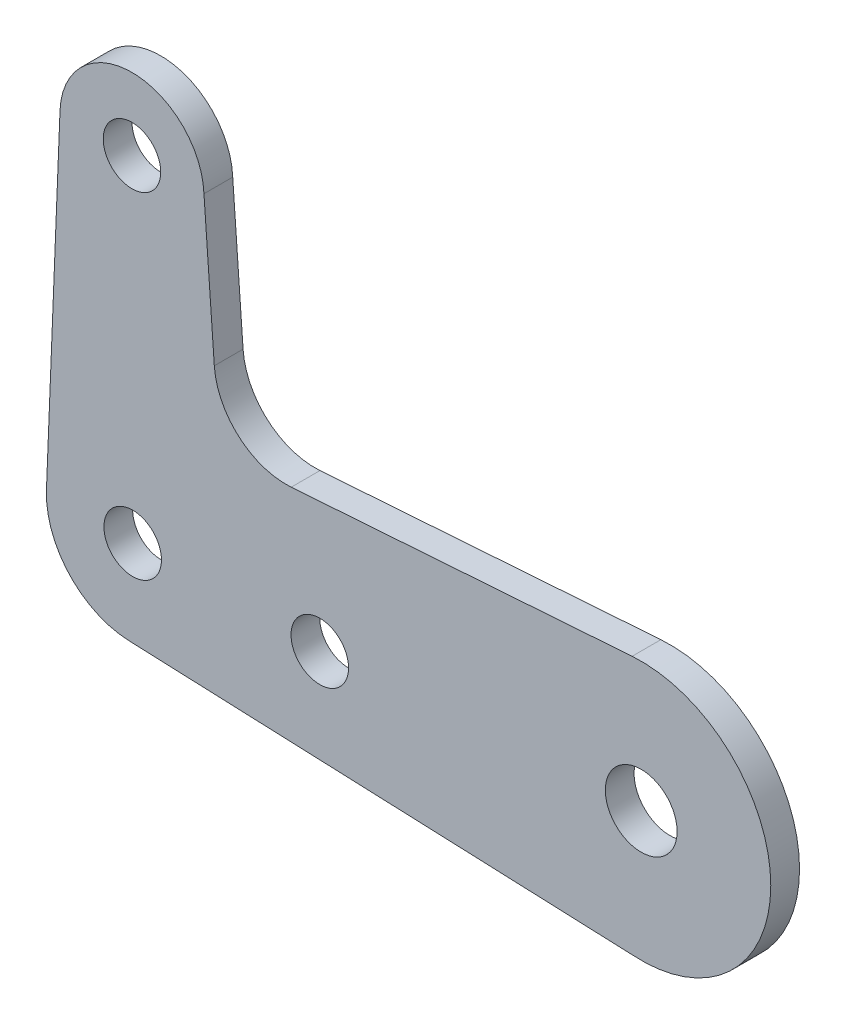
ISO-10303-21;
HEADER;
FILE_DESCRIPTION(('STEP AP214'),'2;1');
FILE_NAME('part.step','',(''),(''),'','','');
FILE_SCHEMA(('AUTOMOTIVE_DESIGN { 1 0 10303 214 1 1 1 1 }'));
ENDSEC;
DATA;
#1=APPLICATION_CONTEXT('core data for automotive mechanical design processes');
#2=APPLICATION_PROTOCOL_DEFINITION('international standard','automotive_design',2000,#1);
#3=PRODUCT_CONTEXT('',#1,'mechanical');
#4=PRODUCT('Part','Part','',(#3));
#5=PRODUCT_RELATED_PRODUCT_CATEGORY('part','',(#4));
#6=PRODUCT_DEFINITION_FORMATION('','',#4);
#7=PRODUCT_DEFINITION_CONTEXT('part definition',#1,'design');
#8=PRODUCT_DEFINITION('design','',#6,#7);
#9=PRODUCT_DEFINITION_SHAPE('','',#8);
#10=(LENGTH_UNIT() NAMED_UNIT(*) SI_UNIT(.MILLI.,.METRE.));
#11=(NAMED_UNIT(*) PLANE_ANGLE_UNIT() SI_UNIT($,.RADIAN.));
#12=(NAMED_UNIT(*) SI_UNIT($,.STERADIAN.) SOLID_ANGLE_UNIT());
#13=UNCERTAINTY_MEASURE_WITH_UNIT(LENGTH_MEASURE(1.E-05),#10,'distance_accuracy_value','');
#14=(GEOMETRIC_REPRESENTATION_CONTEXT(3) GLOBAL_UNCERTAINTY_ASSIGNED_CONTEXT((#13)) GLOBAL_UNIT_ASSIGNED_CONTEXT((#10,
#11,#12)) REPRESENTATION_CONTEXT('',''));
#15=CARTESIAN_POINT('',(0.,0.,0.));
#16=DIRECTION('',(0.,0.,1.));
#17=DIRECTION('',(1.,0.,0.));
#18=AXIS2_PLACEMENT_3D('',#15,#16,#17);
#19=CARTESIAN_POINT('',(-0.654126674944978,30.9800410439159,3.175));
#20=DIRECTION('',(0.,0.,-1.));
#21=DIRECTION('',(-1.,0.,0.));
#22=AXIS2_PLACEMENT_3D('',#19,#20,#21);
#23=CYLINDRICAL_SURFACE('',#22,7.9502);
#24=CARTESIAN_POINT('',(-0.654126674944978,30.9800410439159,0.));
#25=DIRECTION('',(0.,0.,1.));
#26=DIRECTION('',(-1.,0.,0.));
#27=AXIS2_PLACEMENT_3D('',#24,#25,#26);
#28=CIRCLE('',#27,7.9502);
#29=CARTESIAN_POINT('',(7.28957323970543,31.3014624277457,0.));
#30=VERTEX_POINT('',#29);
#31=CARTESIAN_POINT('',(-8.59782658959539,31.3014624277457,0.));
#32=VERTEX_POINT('',#31);
#33=EDGE_CURVE('E134',#30,#32,#28,.T.);
#34=ORIENTED_EDGE('',*,*,#33,.T.);
#35=DIRECTION('',(0.,0.,-1.));
#36=VECTOR('',#35,1.);
#37=CARTESIAN_POINT('',(-8.59782658959539,31.3014624277457,3.175));
#38=LINE('',#37,#36);
#39=CARTESIAN_POINT('',(-8.59782658959539,31.3014624277457,3.175));
#40=VERTEX_POINT('',#39);
#41=EDGE_CURVE('E11',#40,#32,#38,.T.);
#42=ORIENTED_EDGE('',*,*,#41,.F.);
#43=CARTESIAN_POINT('',(-0.654126674944978,30.9800410439159,3.175));
#44=DIRECTION('',(0.,0.,1.));
#45=DIRECTION('',(-1.,0.,0.));
#46=AXIS2_PLACEMENT_3D('',#43,#44,#45);
#47=CIRCLE('',#46,7.9502);
#48=CARTESIAN_POINT('',(7.28957323970543,31.3014624277457,3.175));
#49=VERTEX_POINT('',#48);
#50=EDGE_CURVE('E149',#49,#40,#47,.T.);
#51=ORIENTED_EDGE('',*,*,#50,.F.);
#52=DIRECTION('',(0.,0.,-1.));
#53=VECTOR('',#52,1.);
#54=CARTESIAN_POINT('',(7.28957323970543,31.3014624277457,3.175));
#55=LINE('',#54,#53);
#56=EDGE_CURVE('E130',#49,#30,#55,.T.);
#57=ORIENTED_EDGE('',*,*,#56,.T.);
#58=EDGE_LOOP('',(#34,#42,#51,#57));
#59=FACE_BOUND('',#58,.T.);
#60=ADVANCED_FACE('F38',(#59),#23,.T.);
#61=CARTESIAN_POINT('',(-8.59782658959539,31.3014624277457,3.175));
#62=DIRECTION('',(0.999182399769869,-0.0404293456554278,0.));
#63=DIRECTION('',(0.0404293456554278,0.999182399769869,0.));
#64=AXIS2_PLACEMENT_3D('',#61,#62,#63);
#65=PLANE('',#64);
#66=DIRECTION('',(-0.0404293456554278,-0.999182399769869,0.));
#67=VECTOR('',#66,1.);
#68=CARTESIAN_POINT('',(-8.59782658959539,31.3014624277457,0.));
#69=LINE('',#68,#67);
#70=CARTESIAN_POINT('',(-10.0935116387014,-5.66332521444627,0.));
#71=VERTEX_POINT('',#70);
#72=EDGE_CURVE('E137',#32,#71,#69,.T.);
#73=ORIENTED_EDGE('',*,*,#72,.T.);
#74=DIRECTION('',(0.,0.,-1.));
#75=VECTOR('',#74,1.);
#76=CARTESIAN_POINT('',(-10.0935116387014,-5.66332521444627,3.175));
#77=LINE('',#76,#75);
#78=CARTESIAN_POINT('',(-10.0935116387014,-5.66332521444627,3.175));
#79=VERTEX_POINT('',#78);
#80=EDGE_CURVE('E46',#79,#71,#77,.T.);
#81=ORIENTED_EDGE('',*,*,#80,.F.);
#82=DIRECTION('',(-0.0404293456554278,-0.999182399769869,0.));
#83=VECTOR('',#82,1.);
#84=CARTESIAN_POINT('',(-8.59782658959539,31.3014624277457,3.175));
#85=LINE('',#84,#83);
#86=EDGE_CURVE('E97',#40,#79,#85,.T.);
#87=ORIENTED_EDGE('',*,*,#86,.F.);
#88=ORIENTED_EDGE('',*,*,#41,.T.);
#89=EDGE_LOOP('',(#73,#81,#87,#88));
#90=FACE_BOUND('',#89,.T.);
#91=ADVANCED_FACE('F239',(#90),#65,.F.);
#92=CARTESIAN_POINT('',(-0.576299280893408,-6.04841473181428,3.175));
#93=DIRECTION('',(0.,0.,-1.));
#94=DIRECTION('',(-1.,0.,0.));
#95=AXIS2_PLACEMENT_3D('',#92,#93,#94);
#96=CYLINDRICAL_SURFACE('',#95,9.525);
#97=CARTESIAN_POINT('',(-0.576299280893408,-6.04841473181428,0.));
#98=DIRECTION('',(0.,0.,1.));
#99=DIRECTION('',(1.,0.,0.));
#100=AXIS2_PLACEMENT_3D('',#97,#98,#99);
#101=CIRCLE('',#100,9.525);
#102=CARTESIAN_POINT('',(-0.961388798261291,-15.5656270896223,0.));
#103=VERTEX_POINT('',#102);
#104=EDGE_CURVE('E140',#71,#103,#101,.T.);
#105=ORIENTED_EDGE('',*,*,#104,.T.);
#106=DIRECTION('',(0.,0.,-1.));
#107=VECTOR('',#106,1.);
#108=CARTESIAN_POINT('',(-0.961388798261291,-15.5656270896223,3.175));
#109=LINE('',#108,#107);
#110=CARTESIAN_POINT('',(-0.961388798261291,-15.5656270896223,3.175));
#111=VERTEX_POINT('',#110);
#112=EDGE_CURVE('E156',#111,#103,#109,.T.);
#113=ORIENTED_EDGE('',*,*,#112,.F.);
#114=CARTESIAN_POINT('',(-0.576299280893408,-6.04841473181428,3.175));
#115=DIRECTION('',(0.,0.,1.));
#116=DIRECTION('',(1.,0.,0.));
#117=AXIS2_PLACEMENT_3D('',#114,#115,#116);
#118=CIRCLE('',#117,9.525);
#119=EDGE_CURVE('E164',#79,#111,#118,.T.);
#120=ORIENTED_EDGE('',*,*,#119,.F.);
#121=ORIENTED_EDGE('',*,*,#80,.T.);
#122=EDGE_LOOP('',(#105,#113,#120,#121));
#123=FACE_BOUND('',#122,.T.);
#124=ADVANCED_FACE('F162',(#123),#96,.T.);
#125=CARTESIAN_POINT('',(-0.961388798261289,-15.5656270896223,3.175));
#126=DIRECTION('',(0.0404293456554276,0.999182399769869,0.));
#127=DIRECTION('',(-0.999182399769869,0.0404293456554276,0.));
#128=AXIS2_PLACEMENT_3D('',#125,#126,#127);
#129=PLANE('',#128);
#130=DIRECTION('',(0.999182399769869,-0.0404293456554276,0.));
#131=VECTOR('',#130,1.);
#132=CARTESIAN_POINT('',(-0.961388798261289,-15.5656270896223,0.));
#133=LINE('',#132,#131);
#134=CARTESIAN_POINT('',(54.5453988439306,-17.8115664739884,0.));
#135=VERTEX_POINT('',#134);
#136=EDGE_CURVE('E142',#103,#135,#133,.T.);
#137=ORIENTED_EDGE('',*,*,#136,.T.);
#138=DIRECTION('',(0.,0.,-1.));
#139=VECTOR('',#138,1.);
#140=CARTESIAN_POINT('',(54.5453988439306,-17.8115664739884,3.175));
#141=LINE('',#140,#139);
#142=CARTESIAN_POINT('',(54.5453988439306,-17.8115664739884,3.175));
#143=VERTEX_POINT('',#142);
#144=EDGE_CURVE('E153',#143,#135,#141,.T.);
#145=ORIENTED_EDGE('',*,*,#144,.F.);
#146=DIRECTION('',(0.999182399769869,-0.0404293456554276,0.));
#147=VECTOR('',#146,1.);
#148=CARTESIAN_POINT('',(-0.961388798261289,-15.5656270896223,3.175));
#149=LINE('',#148,#147);
#150=EDGE_CURVE('E176',#111,#143,#149,.T.);
#151=ORIENTED_EDGE('',*,*,#150,.F.);
#152=ORIENTED_EDGE('',*,*,#112,.T.);
#153=EDGE_LOOP('',(#137,#145,#151,#152));
#154=FACE_BOUND('',#153,.T.);
#155=ADVANCED_FACE('F172',(#154),#129,.F.);
#156=CARTESIAN_POINT('',(55.5494597892862,-3.54665912560328,3.175));
#157=DIRECTION('',(0.,0.,-1.));
#158=DIRECTION('',(-1.,0.,0.));
#159=AXIS2_PLACEMENT_3D('',#156,#157,#158);
#160=CYLINDRICAL_SURFACE('',#159,14.3002);
#161=CARTESIAN_POINT('',(55.5494597892862,-3.54665912560328,0.));
#162=DIRECTION('',(0.,0.,1.));
#163=DIRECTION('',(-1.,0.,0.));
#164=AXIS2_PLACEMENT_3D('',#161,#162,#163);
#165=CIRCLE('',#164,14.3002);
#166=CARTESIAN_POINT('',(54.5453988439306,10.7182482227818,0.));
#167=VERTEX_POINT('',#166);
#168=EDGE_CURVE('E144',#135,#167,#165,.T.);
#169=ORIENTED_EDGE('',*,*,#168,.T.);
#170=DIRECTION('',(0.,0.,-1.));
#171=VECTOR('',#170,1.);
#172=CARTESIAN_POINT('',(54.5453988439306,10.7182482227818,3.175));
#173=LINE('',#172,#171);
#174=CARTESIAN_POINT('',(54.5453988439306,10.7182482227818,3.175));
#175=VERTEX_POINT('',#174);
#176=EDGE_CURVE('E125',#175,#167,#173,.T.);
#177=ORIENTED_EDGE('',*,*,#176,.F.);
#178=CARTESIAN_POINT('',(55.5494597892862,-3.54665912560328,3.175));
#179=DIRECTION('',(0.,0.,1.));
#180=DIRECTION('',(-1.,0.,0.));
#181=AXIS2_PLACEMENT_3D('',#178,#179,#180);
#182=CIRCLE('',#181,14.3002);
#183=EDGE_CURVE('E116',#143,#175,#182,.T.);
#184=ORIENTED_EDGE('',*,*,#183,.F.);
#185=ORIENTED_EDGE('',*,*,#144,.T.);
#186=EDGE_LOOP('',(#169,#177,#184,#185));
#187=FACE_BOUND('',#186,.T.);
#188=ADVANCED_FACE('F175',(#187),#160,.T.);
#189=CARTESIAN_POINT('',(16.9203741354891,8.06994375397922,3.175));
#190=DIRECTION('',(0.0702130701217849,-0.997532016921799,0.));
#191=DIRECTION('',(0.997532016921799,0.0702130701217849,0.));
#192=AXIS2_PLACEMENT_3D('',#189,#190,#191);
#193=PLANE('',#192);
#194=DIRECTION('',(-0.997532016921799,-0.0702130701217849,0.));
#195=VECTOR('',#194,1.);
#196=CARTESIAN_POINT('',(16.9203741354891,8.06994375397922,0.));
#197=LINE('',#196,#195);
#198=CARTESIAN_POINT('',(16.9203741354891,8.06994375397922,0.));
#199=VERTEX_POINT('',#198);
#200=EDGE_CURVE('E124',#167,#199,#197,.T.);
#201=ORIENTED_EDGE('',*,*,#200,.T.);
#202=DIRECTION('',(0.,0.,-1.));
#203=VECTOR('',#202,1.);
#204=CARTESIAN_POINT('',(16.9203741354891,8.06994375397922,3.175));
#205=LINE('',#204,#203);
#206=CARTESIAN_POINT('',(16.9203741354891,8.06994375397922,3.175));
#207=VERTEX_POINT('',#206);
#208=EDGE_CURVE('E121',#207,#199,#205,.T.);
#209=ORIENTED_EDGE('',*,*,#208,.F.);
#210=DIRECTION('',(-0.997532016921799,-0.0702130701217849,0.));
#211=VECTOR('',#210,1.);
#212=CARTESIAN_POINT('',(16.9203741354891,8.06994375397922,3.175));
#213=LINE('',#212,#211);
#214=EDGE_CURVE('E110',#175,#207,#213,.T.);
#215=ORIENTED_EDGE('',*,*,#214,.F.);
#216=ORIENTED_EDGE('',*,*,#176,.T.);
#217=EDGE_LOOP('',(#201,#209,#215,#216));
#218=FACE_BOUND('',#217,.T.);
#219=ADVANCED_FACE('F122',(#218),#193,.F.);
#220=CARTESIAN_POINT('',(16.3621661854069,16.0005227949109,3.175));
#221=DIRECTION('',(0.,0.,-1.));
#222=DIRECTION('',(-1.,0.,0.));
#223=AXIS2_PLACEMENT_3D('',#220,#221,#222);
#224=CYLINDRICAL_SURFACE('',#223,7.9502);
#225=CARTESIAN_POINT('',(16.3621661854069,16.0005227949109,0.));
#226=DIRECTION('',(0.,0.,-1.));
#227=DIRECTION('',(1.,0.,0.));
#228=AXIS2_PLACEMENT_3D('',#225,#226,#227);
#229=CIRCLE('',#228,7.9502);
#230=CARTESIAN_POINT('',(8.43249851835871,15.4295142746846,0.));
#231=VERTEX_POINT('',#230);
#232=EDGE_CURVE('E83',#199,#231,#229,.T.);
#233=ORIENTED_EDGE('',*,*,#232,.T.);
#234=DIRECTION('',(0.,0.,-1.));
#235=VECTOR('',#234,1.);
#236=CARTESIAN_POINT('',(8.43249851835871,15.4295142746846,3.175));
#237=LINE('',#236,#235);
#238=CARTESIAN_POINT('',(8.43249851835871,15.4295142746846,3.175));
#239=VERTEX_POINT('',#238);
#240=EDGE_CURVE('E126',#239,#231,#237,.T.);
#241=ORIENTED_EDGE('',*,*,#240,.F.);
#242=CARTESIAN_POINT('',(16.3621661854069,16.0005227949109,3.175));
#243=DIRECTION('',(0.,0.,-1.));
#244=DIRECTION('',(1.,0.,0.));
#245=AXIS2_PLACEMENT_3D('',#242,#243,#244);
#246=CIRCLE('',#245,7.9502);
#247=EDGE_CURVE('E114',#207,#239,#246,.T.);
#248=ORIENTED_EDGE('',*,*,#247,.F.);
#249=ORIENTED_EDGE('',*,*,#208,.T.);
#250=EDGE_LOOP('',(#233,#241,#248,#249));
#251=FACE_BOUND('',#250,.T.);
#252=ADVANCED_FACE('F128',(#251),#224,.F.);
#253=CARTESIAN_POINT('',(8.43249851835871,15.4295142746846,3.175));
#254=DIRECTION('',(-0.997417381581363,-0.0718231642255992,0.));
#255=DIRECTION('',(0.0718231642255992,-0.997417381581363,0.));
#256=AXIS2_PLACEMENT_3D('',#253,#254,#255);
#257=PLANE('',#256);
#258=DIRECTION('',(-0.0718231642255992,0.997417381581363,0.));
#259=VECTOR('',#258,1.);
#260=CARTESIAN_POINT('',(8.43249851835871,15.4295142746846,0.));
#261=LINE('',#260,#259);
#262=EDGE_CURVE('E89',#231,#30,#261,.T.);
#263=ORIENTED_EDGE('',*,*,#262,.T.);
#264=ORIENTED_EDGE('',*,*,#56,.F.);
#265=DIRECTION('',(-0.0718231642255992,0.997417381581363,0.));
#266=VECTOR('',#265,1.);
#267=CARTESIAN_POINT('',(8.43249851835871,15.4295142746846,3.175));
#268=LINE('',#267,#266);
#269=EDGE_CURVE('E54',#239,#49,#268,.T.);
#270=ORIENTED_EDGE('',*,*,#269,.F.);
#271=ORIENTED_EDGE('',*,*,#240,.T.);
#272=EDGE_LOOP('',(#263,#264,#270,#271));
#273=FACE_BOUND('',#272,.T.);
#274=ADVANCED_FACE('F217',(#273),#257,.F.);
#275=CARTESIAN_POINT('',(-0.654126674944978,30.9800410439159,3.175));
#276=DIRECTION('',(0.,0.,-1.));
#277=DIRECTION('',(-1.,0.,0.));
#278=AXIS2_PLACEMENT_3D('',#275,#276,#277);
#279=PLANE('',#278);
#280=CARTESIAN_POINT('',(-0.654126674944978,30.9800410439159,3.175));
#281=DIRECTION('',(0.,0.,1.));
#282=DIRECTION('',(1.,0.,0.));
#283=AXIS2_PLACEMENT_3D('',#280,#281,#282);
#284=CIRCLE('',#283,3.175);
#285=CARTESIAN_POINT('',(2.52087332505502,30.9800410439159,3.175));
#286=VERTEX_POINT('',#285);
#287=EDGE_CURVE('E200',#286,#286,#284,.T.);
#288=ORIENTED_EDGE('',*,*,#287,.F.);
#289=EDGE_LOOP('',(#288));
#290=FACE_BOUND('',#289,.T.);
#291=CARTESIAN_POINT('',(-0.576299280893408,-6.04841473181428,3.175));
#292=DIRECTION('',(0.,0.,1.));
#293=DIRECTION('',(1.,0.,0.));
#294=AXIS2_PLACEMENT_3D('',#291,#292,#293);
#295=CIRCLE('',#294,3.175);
#296=CARTESIAN_POINT('',(2.59870071910659,-6.04841473181428,3.175));
#297=VERTEX_POINT('',#296);
#298=EDGE_CURVE('E197',#297,#297,#295,.T.);
#299=ORIENTED_EDGE('',*,*,#298,.F.);
#300=EDGE_LOOP('',(#299));
#301=FACE_BOUND('',#300,.T.);
#302=CARTESIAN_POINT('',(20.0739007191066,-6.04841473181428,3.175));
#303=DIRECTION('',(0.,0.,1.));
#304=DIRECTION('',(1.,0.,0.));
#305=AXIS2_PLACEMENT_3D('',#302,#303,#304);
#306=CIRCLE('',#305,3.175);
#307=CARTESIAN_POINT('',(23.2489007191066,-6.04841473181428,3.175));
#308=VERTEX_POINT('',#307);
#309=EDGE_CURVE('E191',#308,#308,#306,.T.);
#310=ORIENTED_EDGE('',*,*,#309,.F.);
#311=EDGE_LOOP('',(#310));
#312=FACE_BOUND('',#311,.T.);
#313=CARTESIAN_POINT('',(55.5494597892862,-3.54665912560328,3.175));
#314=DIRECTION('',(0.,0.,1.));
#315=DIRECTION('',(1.,0.,0.));
#316=AXIS2_PLACEMENT_3D('',#313,#314,#315);
#317=CIRCLE('',#316,3.9624);
#318=CARTESIAN_POINT('',(59.5118597892862,-3.54665912560328,3.175));
#319=VERTEX_POINT('',#318);
#320=EDGE_CURVE('E185',#319,#319,#317,.T.);
#321=ORIENTED_EDGE('',*,*,#320,.F.);
#322=EDGE_LOOP('',(#321));
#323=FACE_BOUND('',#322,.T.);
#324=ORIENTED_EDGE('',*,*,#50,.T.);
#325=ORIENTED_EDGE('',*,*,#86,.T.);
#326=ORIENTED_EDGE('',*,*,#119,.T.);
#327=ORIENTED_EDGE('',*,*,#150,.T.);
#328=ORIENTED_EDGE('',*,*,#183,.T.);
#329=ORIENTED_EDGE('',*,*,#214,.T.);
#330=ORIENTED_EDGE('',*,*,#247,.T.);
#331=ORIENTED_EDGE('',*,*,#269,.T.);
#332=EDGE_LOOP('',(#324,#325,#326,#327,#328,#329,#330,#331));
#333=FACE_BOUND('',#332,.T.);
#334=ADVANCED_FACE('F112',(#290,#301,#312,#323,#333),#279,.F.);
#335=CARTESIAN_POINT('',(-0.654126674944978,30.9800410439159,0.));
#336=DIRECTION('',(0.,0.,-1.));
#337=DIRECTION('',(-1.,0.,0.));
#338=AXIS2_PLACEMENT_3D('',#335,#336,#337);
#339=PLANE('',#338);
#340=CARTESIAN_POINT('',(-0.654126674944978,30.9800410439159,0.));
#341=DIRECTION('',(0.,0.,1.));
#342=DIRECTION('',(1.,0.,0.));
#343=AXIS2_PLACEMENT_3D('',#340,#341,#342);
#344=CIRCLE('',#343,3.175);
#345=CARTESIAN_POINT('',(2.52087332505502,30.9800410439159,0.));
#346=VERTEX_POINT('',#345);
#347=EDGE_CURVE('E138',#346,#346,#344,.T.);
#348=ORIENTED_EDGE('',*,*,#347,.T.);
#349=EDGE_LOOP('',(#348));
#350=FACE_BOUND('',#349,.T.);
#351=CARTESIAN_POINT('',(-0.576299280893408,-6.04841473181428,0.));
#352=DIRECTION('',(0.,0.,1.));
#353=DIRECTION('',(1.,0.,0.));
#354=AXIS2_PLACEMENT_3D('',#351,#352,#353);
#355=CIRCLE('',#354,3.175);
#356=CARTESIAN_POINT('',(2.59870071910659,-6.04841473181428,0.));
#357=VERTEX_POINT('',#356);
#358=EDGE_CURVE('E194',#357,#357,#355,.T.);
#359=ORIENTED_EDGE('',*,*,#358,.T.);
#360=EDGE_LOOP('',(#359));
#361=FACE_BOUND('',#360,.T.);
#362=CARTESIAN_POINT('',(20.0739007191066,-6.04841473181428,0.));
#363=DIRECTION('',(0.,0.,1.));
#364=DIRECTION('',(1.,0.,0.));
#365=AXIS2_PLACEMENT_3D('',#362,#363,#364);
#366=CIRCLE('',#365,3.175);
#367=CARTESIAN_POINT('',(23.2489007191066,-6.04841473181428,0.));
#368=VERTEX_POINT('',#367);
#369=EDGE_CURVE('E188',#368,#368,#366,.T.);
#370=ORIENTED_EDGE('',*,*,#369,.T.);
#371=EDGE_LOOP('',(#370));
#372=FACE_BOUND('',#371,.T.);
#373=CARTESIAN_POINT('',(55.5494597892862,-3.54665912560328,0.));
#374=DIRECTION('',(0.,0.,1.));
#375=DIRECTION('',(1.,0.,0.));
#376=AXIS2_PLACEMENT_3D('',#373,#374,#375);
#377=CIRCLE('',#376,3.9624);
#378=CARTESIAN_POINT('',(59.5118597892862,-3.54665912560328,0.));
#379=VERTEX_POINT('',#378);
#380=EDGE_CURVE('E182',#379,#379,#377,.T.);
#381=ORIENTED_EDGE('',*,*,#380,.T.);
#382=EDGE_LOOP('',(#381));
#383=FACE_BOUND('',#382,.T.);
#384=ORIENTED_EDGE('',*,*,#33,.F.);
#385=ORIENTED_EDGE('',*,*,#262,.F.);
#386=ORIENTED_EDGE('',*,*,#232,.F.);
#387=ORIENTED_EDGE('',*,*,#200,.F.);
#388=ORIENTED_EDGE('',*,*,#168,.F.);
#389=ORIENTED_EDGE('',*,*,#136,.F.);
#390=ORIENTED_EDGE('',*,*,#104,.F.);
#391=ORIENTED_EDGE('',*,*,#72,.F.);
#392=EDGE_LOOP('',(#384,#385,#386,#387,#388,#389,#390,#391));
#393=FACE_BOUND('',#392,.T.);
#394=ADVANCED_FACE('F168',(#350,#361,#372,#383,#393),#339,.T.);
#395=CARTESIAN_POINT('',(55.5494597892862,-3.54665912560328,0.));
#396=DIRECTION('',(0.,0.,1.));
#397=DIRECTION('',(1.,0.,0.));
#398=AXIS2_PLACEMENT_3D('',#395,#396,#397);
#399=CYLINDRICAL_SURFACE('',#398,3.9624);
#400=ORIENTED_EDGE('',*,*,#380,.F.);
#401=EDGE_LOOP('',(#400));
#402=FACE_BOUND('',#401,.T.);
#403=ORIENTED_EDGE('',*,*,#320,.T.);
#404=EDGE_LOOP('',(#403));
#405=FACE_BOUND('',#404,.T.);
#406=ADVANCED_FACE('F225',(#402,#405),#399,.F.);
#407=CARTESIAN_POINT('',(20.0739007191066,-6.04841473181428,0.));
#408=DIRECTION('',(0.,0.,1.));
#409=DIRECTION('',(1.,0.,0.));
#410=AXIS2_PLACEMENT_3D('',#407,#408,#409);
#411=CYLINDRICAL_SURFACE('',#410,3.175);
#412=ORIENTED_EDGE('',*,*,#369,.F.);
#413=EDGE_LOOP('',(#412));
#414=FACE_BOUND('',#413,.T.);
#415=ORIENTED_EDGE('',*,*,#309,.T.);
#416=EDGE_LOOP('',(#415));
#417=FACE_BOUND('',#416,.T.);
#418=ADVANCED_FACE('F227',(#414,#417),#411,.F.);
#419=CARTESIAN_POINT('',(-0.576299280893408,-6.04841473181428,0.));
#420=DIRECTION('',(0.,0.,1.));
#421=DIRECTION('',(1.,0.,0.));
#422=AXIS2_PLACEMENT_3D('',#419,#420,#421);
#423=CYLINDRICAL_SURFACE('',#422,3.175);
#424=ORIENTED_EDGE('',*,*,#358,.F.);
#425=EDGE_LOOP('',(#424));
#426=FACE_BOUND('',#425,.T.);
#427=ORIENTED_EDGE('',*,*,#298,.T.);
#428=EDGE_LOOP('',(#427));
#429=FACE_BOUND('',#428,.T.);
#430=ADVANCED_FACE('F211',(#426,#429),#423,.F.);
#431=CARTESIAN_POINT('',(-0.654126674944978,30.9800410439159,0.));
#432=DIRECTION('',(0.,0.,1.));
#433=DIRECTION('',(1.,0.,0.));
#434=AXIS2_PLACEMENT_3D('',#431,#432,#433);
#435=CYLINDRICAL_SURFACE('',#434,3.175);
#436=ORIENTED_EDGE('',*,*,#347,.F.);
#437=EDGE_LOOP('',(#436));
#438=FACE_BOUND('',#437,.T.);
#439=ORIENTED_EDGE('',*,*,#287,.T.);
#440=EDGE_LOOP('',(#439));
#441=FACE_BOUND('',#440,.T.);
#442=ADVANCED_FACE('F208',(#438,#441),#435,.F.);
#443=CLOSED_SHELL('',(#60,#91,#124,#155,#188,#219,#252,#274,#334,#394,#406,#418,#430,#442));
#444=MANIFOLD_SOLID_BREP('B2',#443);
#445=ADVANCED_BREP_SHAPE_REPRESENTATION('',(#18,#444),#14);
#446=SHAPE_DEFINITION_REPRESENTATION(#9,#445);
ENDSEC;
END-ISO-10303-21;
